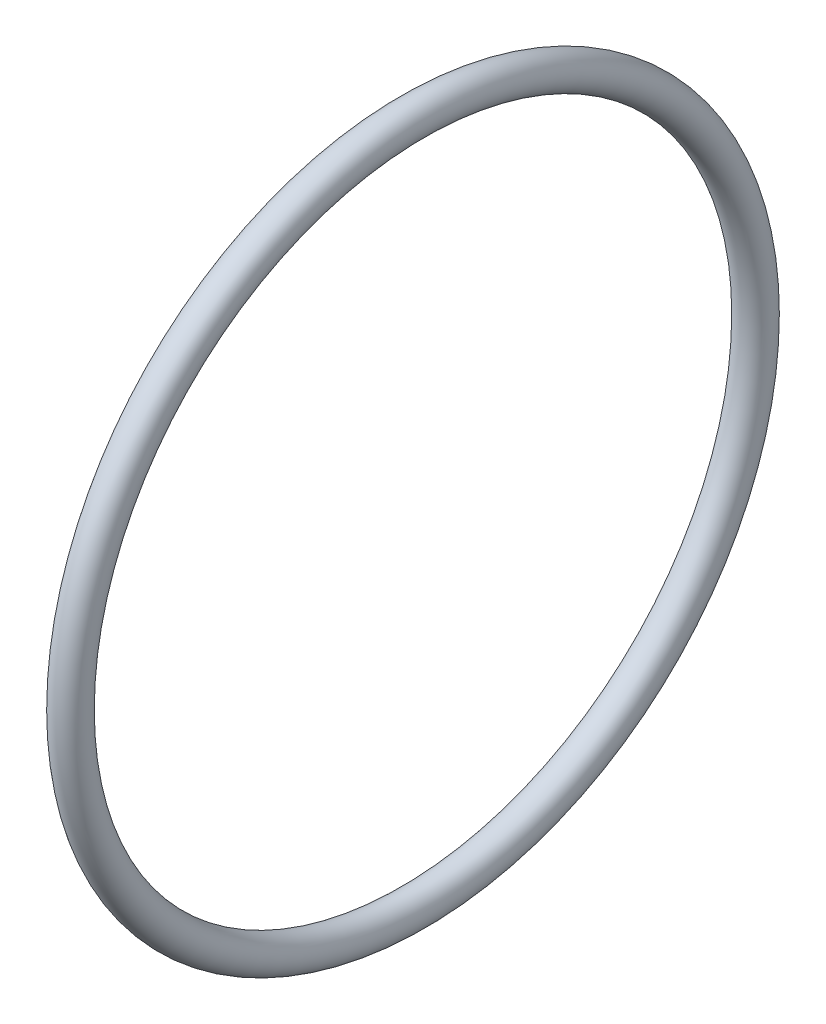
ISO-10303-21;
HEADER;
FILE_DESCRIPTION(('STEP AP214'),'2;1');
FILE_NAME('part.step','',(''),(''),'','','');
FILE_SCHEMA(('AUTOMOTIVE_DESIGN { 1 0 10303 214 1 1 1 1 }'));
ENDSEC;
DATA;
#1=APPLICATION_CONTEXT('core data for automotive mechanical design processes');
#2=APPLICATION_PROTOCOL_DEFINITION('international standard','automotive_design',2000,#1);
#3=PRODUCT_CONTEXT('',#1,'mechanical');
#4=PRODUCT('Part','Part','',(#3));
#5=PRODUCT_RELATED_PRODUCT_CATEGORY('part','',(#4));
#6=PRODUCT_DEFINITION_FORMATION('','',#4);
#7=PRODUCT_DEFINITION_CONTEXT('part definition',#1,'design');
#8=PRODUCT_DEFINITION('design','',#6,#7);
#9=PRODUCT_DEFINITION_SHAPE('','',#8);
#10=(LENGTH_UNIT() NAMED_UNIT(*) SI_UNIT(.MILLI.,.METRE.));
#11=(NAMED_UNIT(*) PLANE_ANGLE_UNIT() SI_UNIT($,.RADIAN.));
#12=(NAMED_UNIT(*) SI_UNIT($,.STERADIAN.) SOLID_ANGLE_UNIT());
#13=UNCERTAINTY_MEASURE_WITH_UNIT(LENGTH_MEASURE(1.E-05),#10,'distance_accuracy_value','');
#14=(GEOMETRIC_REPRESENTATION_CONTEXT(3) GLOBAL_UNCERTAINTY_ASSIGNED_CONTEXT((#13)) GLOBAL_UNIT_ASSIGNED_CONTEXT((#10,
#11,#12)) REPRESENTATION_CONTEXT('',''));
#15=CARTESIAN_POINT('',(0.,0.,0.));
#16=DIRECTION('',(0.,0.,1.));
#17=DIRECTION('',(1.,0.,0.));
#18=AXIS2_PLACEMENT_3D('',#15,#16,#17);
#19=CARTESIAN_POINT('',(0.,-15.25,0.));
#20=DIRECTION('',(-1.,0.,0.));
#21=DIRECTION('',(0.,0.,1.));
#22=AXIS2_PLACEMENT_3D('',#19,#20,#21);
#23=TOROIDAL_SURFACE('',#22,15.25,0.75);
#24=CARTESIAN_POINT('',(0.,-15.25,16.));
#25=VERTEX_POINT('',#24);
#26=VERTEX_LOOP('',#25);
#27=FACE_BOUND('',#26,.T.);
#28=ADVANCED_FACE('F28',(#27),#23,.T.);
#29=CLOSED_SHELL('',(#28));
#30=MANIFOLD_SOLID_BREP('B2',#29);
#31=ADVANCED_BREP_SHAPE_REPRESENTATION('',(#18,#30),#14);
#32=SHAPE_DEFINITION_REPRESENTATION(#9,#31);
ENDSEC;
END-ISO-10303-21;
